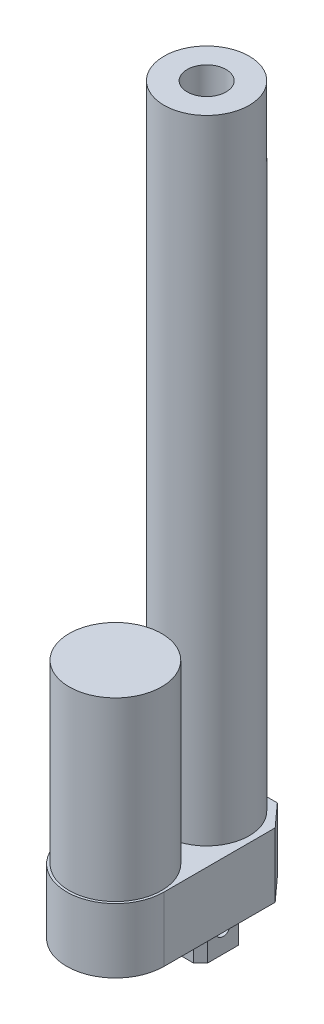
ISO-10303-21;
HEADER;
FILE_DESCRIPTION(('STEP AP214'),'2;1');
FILE_NAME('part.step','',(''),(''),'','','');
FILE_SCHEMA(('AUTOMOTIVE_DESIGN { 1 0 10303 214 1 1 1 1 }'));
ENDSEC;
DATA;
#1=APPLICATION_CONTEXT('core data for automotive mechanical design processes');
#2=APPLICATION_PROTOCOL_DEFINITION('international standard','automotive_design',2000,#1);
#3=PRODUCT_CONTEXT('',#1,'mechanical');
#4=PRODUCT('Part','Part','',(#3));
#5=PRODUCT_RELATED_PRODUCT_CATEGORY('part','',(#4));
#6=PRODUCT_DEFINITION_FORMATION('','',#4);
#7=PRODUCT_DEFINITION_CONTEXT('part definition',#1,'design');
#8=PRODUCT_DEFINITION('design','',#6,#7);
#9=PRODUCT_DEFINITION_SHAPE('','',#8);
#10=(LENGTH_UNIT() NAMED_UNIT(*) SI_UNIT(.MILLI.,.METRE.));
#11=(NAMED_UNIT(*) PLANE_ANGLE_UNIT() SI_UNIT($,.RADIAN.));
#12=(NAMED_UNIT(*) SI_UNIT($,.STERADIAN.) SOLID_ANGLE_UNIT());
#13=UNCERTAINTY_MEASURE_WITH_UNIT(LENGTH_MEASURE(1.E-05),#10,'distance_accuracy_value','');
#14=(GEOMETRIC_REPRESENTATION_CONTEXT(3) GLOBAL_UNCERTAINTY_ASSIGNED_CONTEXT((#13)) GLOBAL_UNIT_ASSIGNED_CONTEXT((#10,
#11,#12)) REPRESENTATION_CONTEXT('',''));
#15=CARTESIAN_POINT('',(0.,0.,0.));
#16=DIRECTION('',(0.,0.,1.));
#17=DIRECTION('',(1.,0.,0.));
#18=AXIS2_PLACEMENT_3D('',#15,#16,#17);
#19=CARTESIAN_POINT('',(0.,0.,17.5));
#20=DIRECTION('',(0.,1.,0.));
#21=DIRECTION('',(0.,0.,1.));
#22=AXIS2_PLACEMENT_3D('',#19,#20,#21);
#23=PLANE('',#22);
#24=DIRECTION('',(-0.671598777527421,0.,0.740915030231992));
#25=VECTOR('',#24,1.);
#26=CARTESIAN_POINT('',(-20.,0.,-28.1703672959389));
#27=LINE('',#26,#25);
#28=CARTESIAN_POINT('',(-11.5432004168341,0.,-37.5));
#29=VERTEX_POINT('',#28);
#30=CARTESIAN_POINT('',(-20.,0.,-28.1703672959389));
#31=VERTEX_POINT('',#30);
#32=EDGE_CURVE('E170',#29,#31,#27,.T.);
#33=ORIENTED_EDGE('',*,*,#32,.F.);
#34=DIRECTION('',(-1.,0.,0.));
#35=VECTOR('',#34,1.);
#36=CARTESIAN_POINT('',(11.5432004168341,0.,-37.5));
#37=LINE('',#36,#35);
#38=CARTESIAN_POINT('',(11.5432004168341,0.,-37.5));
#39=VERTEX_POINT('',#38);
#40=EDGE_CURVE('E176',#39,#29,#37,.T.);
#41=ORIENTED_EDGE('',*,*,#40,.F.);
#42=DIRECTION('',(-0.671598777527421,0.,-0.740915030231992));
#43=VECTOR('',#42,1.);
#44=CARTESIAN_POINT('',(20.,0.,-28.1703672959389));
#45=LINE('',#44,#43);
#46=CARTESIAN_POINT('',(20.,0.,-28.1703672959389));
#47=VERTEX_POINT('',#46);
#48=EDGE_CURVE('E197',#47,#39,#45,.T.);
#49=ORIENTED_EDGE('',*,*,#48,.F.);
#50=DIRECTION('',(0.,0.,-1.));
#51=VECTOR('',#50,1.);
#52=CARTESIAN_POINT('',(20.,0.,17.5));
#53=LINE('',#52,#51);
#54=CARTESIAN_POINT('',(20.,0.,17.5));
#55=VERTEX_POINT('',#54);
#56=EDGE_CURVE('E195',#55,#47,#53,.T.);
#57=ORIENTED_EDGE('',*,*,#56,.F.);
#58=CARTESIAN_POINT('',(0.,0.,17.5));
#59=DIRECTION('',(0.,1.,0.));
#60=DIRECTION('',(0.,0.,1.));
#61=AXIS2_PLACEMENT_3D('',#58,#59,#60);
#62=CIRCLE('',#61,20.);
#63=CARTESIAN_POINT('',(-20.,0.,17.5));
#64=VERTEX_POINT('',#63);
#65=EDGE_CURVE('E193',#64,#55,#62,.T.);
#66=ORIENTED_EDGE('',*,*,#65,.F.);
#67=DIRECTION('',(0.,0.,1.));
#68=VECTOR('',#67,1.);
#69=CARTESIAN_POINT('',(-20.,0.,17.5));
#70=LINE('',#69,#68);
#71=EDGE_CURVE('E191',#31,#64,#70,.T.);
#72=ORIENTED_EDGE('',*,*,#71,.F.);
#73=EDGE_LOOP('',(#33,#41,#49,#57,#66,#72));
#74=FACE_BOUND('',#73,.T.);
#75=DIRECTION('',(0.707106781186551,0.,-0.707106781186544));
#76=VECTOR('',#75,1.);
#77=CARTESIAN_POINT('',(-9.25,0.,-23.8703082855105));
#78=LINE('',#77,#76);
#79=CARTESIAN_POINT('',(-9.25,0.,-23.8703082855105));
#80=VERTEX_POINT('',#79);
#81=CARTESIAN_POINT('',(-6.37030828551044,0.,-26.75));
#82=VERTEX_POINT('',#81);
#83=EDGE_CURVE('E159',#80,#82,#78,.T.);
#84=ORIENTED_EDGE('',*,*,#83,.F.);
#85=DIRECTION('',(0.,0.,-1.));
#86=VECTOR('',#85,1.);
#87=CARTESIAN_POINT('',(-9.25,0.,-23.8703082855105));
#88=LINE('',#87,#86);
#89=CARTESIAN_POINT('',(-9.25,0.,-11.1296917144895));
#90=VERTEX_POINT('',#89);
#91=EDGE_CURVE('E156',#90,#80,#88,.T.);
#92=ORIENTED_EDGE('',*,*,#91,.F.);
#93=DIRECTION('',(-0.707106781186547,0.,-0.707106781186548));
#94=VECTOR('',#93,1.);
#95=CARTESIAN_POINT('',(-6.37030828551046,0.,-8.25));
#96=LINE('',#95,#94);
#97=CARTESIAN_POINT('',(-6.37030828551046,0.,-8.25));
#98=VERTEX_POINT('',#97);
#99=EDGE_CURVE('E283',#98,#90,#96,.T.);
#100=ORIENTED_EDGE('',*,*,#99,.F.);
#101=DIRECTION('',(-1.,0.,0.));
#102=VECTOR('',#101,1.);
#103=CARTESIAN_POINT('',(6.37030828551054,0.,-8.24999999999999));
#104=LINE('',#103,#102);
#105=CARTESIAN_POINT('',(6.37030828551054,0.,-8.24999999999999));
#106=VERTEX_POINT('',#105);
#107=EDGE_CURVE('E280',#106,#98,#104,.T.);
#108=ORIENTED_EDGE('',*,*,#107,.F.);
#109=DIRECTION('',(-0.707106781186551,0.,0.707106781186544));
#110=VECTOR('',#109,1.);
#111=CARTESIAN_POINT('',(9.25,0.,-11.1296917144894));
#112=LINE('',#111,#110);
#113=CARTESIAN_POINT('',(9.25,0.,-11.1296917144894));
#114=VERTEX_POINT('',#113);
#115=EDGE_CURVE('E277',#114,#106,#112,.T.);
#116=ORIENTED_EDGE('',*,*,#115,.F.);
#117=DIRECTION('',(0.,0.,1.));
#118=VECTOR('',#117,1.);
#119=CARTESIAN_POINT('',(9.25,0.,-23.8703082855104));
#120=LINE('',#119,#118);
#121=CARTESIAN_POINT('',(9.25,0.,-23.8703082855104));
#122=VERTEX_POINT('',#121);
#123=EDGE_CURVE('E274',#122,#114,#120,.T.);
#124=ORIENTED_EDGE('',*,*,#123,.F.);
#125=DIRECTION('',(0.707106781186541,0.,0.707106781186554));
#126=VECTOR('',#125,1.);
#127=CARTESIAN_POINT('',(6.37030828551048,0.,-26.75));
#128=LINE('',#127,#126);
#129=CARTESIAN_POINT('',(6.37030828551047,0.,-26.75));
#130=VERTEX_POINT('',#129);
#131=EDGE_CURVE('E271',#130,#122,#128,.T.);
#132=ORIENTED_EDGE('',*,*,#131,.F.);
#133=DIRECTION('',(1.,0.,0.));
#134=VECTOR('',#133,1.);
#135=CARTESIAN_POINT('',(6.37030828551048,0.,-26.75));
#136=LINE('',#135,#134);
#137=EDGE_CURVE('E54',#82,#130,#136,.T.);
#138=ORIENTED_EDGE('',*,*,#137,.F.);
#139=EDGE_LOOP('',(#84,#92,#100,#108,#116,#124,#132,#138));
#140=FACE_BOUND('',#139,.T.);
#141=ADVANCED_FACE('F34',(#74,#140),#23,.F.);
#142=CARTESIAN_POINT('',(-20.,26.5,-28.1703672959389));
#143=DIRECTION('',(0.740915030231992,0.,0.671598777527421));
#144=DIRECTION('',(0.671598777527421,0.,-0.740915030231992));
#145=AXIS2_PLACEMENT_3D('',#142,#143,#144);
#146=PLANE('',#145);
#147=ORIENTED_EDGE('',*,*,#32,.T.);
#148=DIRECTION('',(0.,-1.,0.));
#149=VECTOR('',#148,1.);
#150=CARTESIAN_POINT('',(-20.,26.5,-28.1703672959389));
#151=LINE('',#150,#149);
#152=CARTESIAN_POINT('',(-20.,26.5,-28.1703672959389));
#153=VERTEX_POINT('',#152);
#154=EDGE_CURVE('E11',#153,#31,#151,.T.);
#155=ORIENTED_EDGE('',*,*,#154,.F.);
#156=DIRECTION('',(-0.671598777527421,0.,0.740915030231992));
#157=VECTOR('',#156,1.);
#158=CARTESIAN_POINT('',(-20.,26.5,-28.1703672959389));
#159=LINE('',#158,#157);
#160=CARTESIAN_POINT('',(-11.5432004168341,26.5,-37.5));
#161=VERTEX_POINT('',#160);
#162=EDGE_CURVE('E172',#161,#153,#159,.T.);
#163=ORIENTED_EDGE('',*,*,#162,.F.);
#164=DIRECTION('',(0.,-1.,0.));
#165=VECTOR('',#164,1.);
#166=CARTESIAN_POINT('',(-11.5432004168341,26.5,-37.5));
#167=LINE('',#166,#165);
#168=EDGE_CURVE('E188',#161,#29,#167,.T.);
#169=ORIENTED_EDGE('',*,*,#168,.T.);
#170=EDGE_LOOP('',(#147,#155,#163,#169));
#171=FACE_BOUND('',#170,.T.);
#172=ADVANCED_FACE('F36',(#171),#146,.F.);
#173=CARTESIAN_POINT('',(-20.,26.5,17.5));
#174=DIRECTION('',(1.,0.,0.));
#175=DIRECTION('',(0.,0.,-1.));
#176=AXIS2_PLACEMENT_3D('',#173,#174,#175);
#177=PLANE('',#176);
#178=ORIENTED_EDGE('',*,*,#71,.T.);
#179=DIRECTION('',(0.,-1.,0.));
#180=VECTOR('',#179,1.);
#181=CARTESIAN_POINT('',(-20.,26.5,17.5));
#182=LINE('',#181,#180);
#183=CARTESIAN_POINT('',(-20.,26.5,17.5));
#184=VERTEX_POINT('',#183);
#185=EDGE_CURVE('E42',#184,#64,#182,.T.);
#186=ORIENTED_EDGE('',*,*,#185,.F.);
#187=DIRECTION('',(0.,0.,1.));
#188=VECTOR('',#187,1.);
#189=CARTESIAN_POINT('',(-20.,26.5,17.5));
#190=LINE('',#189,#188);
#191=EDGE_CURVE('E175',#153,#184,#190,.T.);
#192=ORIENTED_EDGE('',*,*,#191,.F.);
#193=ORIENTED_EDGE('',*,*,#154,.T.);
#194=EDGE_LOOP('',(#178,#186,#192,#193));
#195=FACE_BOUND('',#194,.T.);
#196=ADVANCED_FACE('F236',(#195),#177,.F.);
#197=CARTESIAN_POINT('',(0.,26.5,17.5));
#198=DIRECTION('',(0.,-1.,0.));
#199=DIRECTION('',(0.,0.,-1.));
#200=AXIS2_PLACEMENT_3D('',#197,#198,#199);
#201=CYLINDRICAL_SURFACE('',#200,20.);
#202=ORIENTED_EDGE('',*,*,#65,.T.);
#203=DIRECTION('',(0.,-1.,0.));
#204=VECTOR('',#203,1.);
#205=CARTESIAN_POINT('',(20.,26.5,17.5));
#206=LINE('',#205,#204);
#207=CARTESIAN_POINT('',(20.,26.5,17.5));
#208=VERTEX_POINT('',#207);
#209=EDGE_CURVE('E208',#208,#55,#206,.T.);
#210=ORIENTED_EDGE('',*,*,#209,.F.);
#211=CARTESIAN_POINT('',(0.,26.5,17.5));
#212=DIRECTION('',(0.,1.,0.));
#213=DIRECTION('',(0.,0.,1.));
#214=AXIS2_PLACEMENT_3D('',#211,#212,#213);
#215=CIRCLE('',#214,20.);
#216=EDGE_CURVE('E178',#184,#208,#215,.T.);
#217=ORIENTED_EDGE('',*,*,#216,.F.);
#218=ORIENTED_EDGE('',*,*,#185,.T.);
#219=EDGE_LOOP('',(#202,#210,#217,#218));
#220=FACE_BOUND('',#219,.T.);
#221=ADVANCED_FACE('F215',(#220),#201,.T.);
#222=CARTESIAN_POINT('',(20.,26.5,17.5));
#223=DIRECTION('',(-1.,0.,0.));
#224=DIRECTION('',(0.,0.,1.));
#225=AXIS2_PLACEMENT_3D('',#222,#223,#224);
#226=PLANE('',#225);
#227=ORIENTED_EDGE('',*,*,#56,.T.);
#228=DIRECTION('',(0.,-1.,0.));
#229=VECTOR('',#228,1.);
#230=CARTESIAN_POINT('',(20.,26.5,-28.1703672959389));
#231=LINE('',#230,#229);
#232=CARTESIAN_POINT('',(20.,26.5,-28.1703672959389));
#233=VERTEX_POINT('',#232);
#234=EDGE_CURVE('E205',#233,#47,#231,.T.);
#235=ORIENTED_EDGE('',*,*,#234,.F.);
#236=DIRECTION('',(0.,0.,-1.));
#237=VECTOR('',#236,1.);
#238=CARTESIAN_POINT('',(20.,26.5,17.5));
#239=LINE('',#238,#237);
#240=EDGE_CURVE('E180',#208,#233,#239,.T.);
#241=ORIENTED_EDGE('',*,*,#240,.F.);
#242=ORIENTED_EDGE('',*,*,#209,.T.);
#243=EDGE_LOOP('',(#227,#235,#241,#242));
#244=FACE_BOUND('',#243,.T.);
#245=ADVANCED_FACE('F225',(#244),#226,.F.);
#246=CARTESIAN_POINT('',(20.,26.5,-28.1703672959389));
#247=DIRECTION('',(-0.740915030231992,0.,0.671598777527421));
#248=DIRECTION('',(0.671598777527421,0.,0.740915030231992));
#249=AXIS2_PLACEMENT_3D('',#246,#247,#248);
#250=PLANE('',#249);
#251=ORIENTED_EDGE('',*,*,#48,.T.);
#252=DIRECTION('',(0.,-1.,0.));
#253=VECTOR('',#252,1.);
#254=CARTESIAN_POINT('',(11.5432004168341,26.5,-37.5));
#255=LINE('',#254,#253);
#256=CARTESIAN_POINT('',(11.5432004168341,26.5,-37.5));
#257=VERTEX_POINT('',#256);
#258=EDGE_CURVE('E202',#257,#39,#255,.T.);
#259=ORIENTED_EDGE('',*,*,#258,.F.);
#260=DIRECTION('',(-0.671598777527421,0.,-0.740915030231992));
#261=VECTOR('',#260,1.);
#262=CARTESIAN_POINT('',(20.,26.5,-28.1703672959389));
#263=LINE('',#262,#261);
#264=EDGE_CURVE('E182',#233,#257,#263,.T.);
#265=ORIENTED_EDGE('',*,*,#264,.F.);
#266=ORIENTED_EDGE('',*,*,#234,.T.);
#267=EDGE_LOOP('',(#251,#259,#265,#266));
#268=FACE_BOUND('',#267,.T.);
#269=ADVANCED_FACE('F229',(#268),#250,.F.);
#270=CARTESIAN_POINT('',(11.5432004168341,26.5,-37.5));
#271=DIRECTION('',(0.,0.,1.));
#272=DIRECTION('',(1.,0.,0.));
#273=AXIS2_PLACEMENT_3D('',#270,#271,#272);
#274=PLANE('',#273);
#275=ORIENTED_EDGE('',*,*,#40,.T.);
#276=ORIENTED_EDGE('',*,*,#168,.F.);
#277=DIRECTION('',(-1.,0.,0.));
#278=VECTOR('',#277,1.);
#279=CARTESIAN_POINT('',(11.5432004168341,26.5,-37.5));
#280=LINE('',#279,#278);
#281=CARTESIAN_POINT('',(0.,26.5,-37.5));
#282=VERTEX_POINT('',#281);
#283=EDGE_CURVE('E184',#282,#161,#280,.T.);
#284=ORIENTED_EDGE('',*,*,#283,.F.);
#285=EDGE_CURVE('E185',#257,#282,#280,.T.);
#286=ORIENTED_EDGE('',*,*,#285,.F.);
#287=ORIENTED_EDGE('',*,*,#258,.T.);
#288=EDGE_LOOP('',(#275,#276,#284,#286,#287));
#289=FACE_BOUND('',#288,.T.);
#290=ADVANCED_FACE('F240',(#289),#274,.F.);
#291=CARTESIAN_POINT('',(0.,26.5,17.5));
#292=DIRECTION('',(0.,1.,0.));
#293=DIRECTION('',(0.,0.,1.));
#294=AXIS2_PLACEMENT_3D('',#291,#292,#293);
#295=PLANE('',#294);
#296=CARTESIAN_POINT('',(0.,26.5,17.5));
#297=DIRECTION('',(0.,1.,0.));
#298=DIRECTION('',(0.,0.,1.));
#299=AXIS2_PLACEMENT_3D('',#296,#297,#298);
#300=CIRCLE('',#299,19.);
#301=CARTESIAN_POINT('',(0.,26.5,36.5));
#302=VERTEX_POINT('',#301);
#303=EDGE_CURVE('E160',#302,#302,#300,.T.);
#304=ORIENTED_EDGE('',*,*,#303,.F.);
#305=EDGE_LOOP('',(#304));
#306=FACE_BOUND('',#305,.T.);
#307=ORIENTED_EDGE('',*,*,#285,.T.);
#308=CARTESIAN_POINT('',(0.,26.5,-20.));
#309=DIRECTION('',(0.,1.,0.));
#310=DIRECTION('',(0.,0.,1.));
#311=AXIS2_PLACEMENT_3D('',#308,#309,#310);
#312=CIRCLE('',#311,17.5);
#313=EDGE_CURVE('E47',#282,#282,#312,.T.);
#314=ORIENTED_EDGE('',*,*,#313,.F.);
#315=ORIENTED_EDGE('',*,*,#283,.T.);
#316=ORIENTED_EDGE('',*,*,#162,.T.);
#317=ORIENTED_EDGE('',*,*,#191,.T.);
#318=ORIENTED_EDGE('',*,*,#216,.T.);
#319=ORIENTED_EDGE('',*,*,#240,.T.);
#320=ORIENTED_EDGE('',*,*,#264,.T.);
#321=EDGE_LOOP('',(#307,#314,#315,#316,#317,#318,#319,#320));
#322=FACE_BOUND('',#321,.T.);
#323=ADVANCED_FACE('F233',(#306,#322),#295,.T.);
#324=CARTESIAN_POINT('',(0.,99.,17.5));
#325=DIRECTION('',(0.,-1.,0.));
#326=DIRECTION('',(0.,0.,-1.));
#327=AXIS2_PLACEMENT_3D('',#324,#325,#326);
#328=CYLINDRICAL_SURFACE('',#327,19.);
#329=CARTESIAN_POINT('',(0.,99.,17.5));
#330=DIRECTION('',(0.,1.,0.));
#331=DIRECTION('',(0.,0.,1.));
#332=AXIS2_PLACEMENT_3D('',#329,#330,#331);
#333=CIRCLE('',#332,19.);
#334=CARTESIAN_POINT('',(0.,99.,36.5));
#335=VERTEX_POINT('',#334);
#336=EDGE_CURVE('E163',#335,#335,#333,.T.);
#337=ORIENTED_EDGE('',*,*,#336,.F.);
#338=EDGE_LOOP('',(#337));
#339=FACE_BOUND('',#338,.T.);
#340=ORIENTED_EDGE('',*,*,#303,.T.);
#341=EDGE_LOOP('',(#340));
#342=FACE_BOUND('',#341,.T.);
#343=ADVANCED_FACE('F376',(#339,#342),#328,.T.);
#344=CARTESIAN_POINT('',(0.,99.,17.5));
#345=DIRECTION('',(0.,1.,0.));
#346=DIRECTION('',(0.,0.,1.));
#347=AXIS2_PLACEMENT_3D('',#344,#345,#346);
#348=PLANE('',#347);
#349=ORIENTED_EDGE('',*,*,#336,.T.);
#350=EDGE_LOOP('',(#349));
#351=FACE_BOUND('',#350,.T.);
#352=ADVANCED_FACE('F383',(#351),#348,.T.);
#353=CARTESIAN_POINT('',(-9.25,-18.5,-23.8703082855105));
#354=DIRECTION('',(0.707106781186544,0.,0.707106781186551));
#355=DIRECTION('',(0.707106781186551,0.,-0.707106781186544));
#356=AXIS2_PLACEMENT_3D('',#353,#354,#355);
#357=PLANE('',#356);
#358=ORIENTED_EDGE('',*,*,#83,.T.);
#359=DIRECTION('',(0.,1.,0.));
#360=VECTOR('',#359,1.);
#361=CARTESIAN_POINT('',(-6.37030828551044,-18.5,-26.75));
#362=LINE('',#361,#360);
#363=CARTESIAN_POINT('',(-6.37030828551044,-18.5,-26.75));
#364=VERTEX_POINT('',#363);
#365=EDGE_CURVE('E140',#364,#82,#362,.T.);
#366=ORIENTED_EDGE('',*,*,#365,.F.);
#367=DIRECTION('',(0.707106781186551,0.,-0.707106781186544));
#368=VECTOR('',#367,1.);
#369=CARTESIAN_POINT('',(-9.25,-18.5,-23.8703082855105));
#370=LINE('',#369,#368);
#371=CARTESIAN_POINT('',(-9.25,-18.5,-23.8703082855105));
#372=VERTEX_POINT('',#371);
#373=EDGE_CURVE('E147',#372,#364,#370,.T.);
#374=ORIENTED_EDGE('',*,*,#373,.F.);
#375=DIRECTION('',(0.,1.,0.));
#376=VECTOR('',#375,1.);
#377=CARTESIAN_POINT('',(-9.25,-18.5,-23.8703082855105));
#378=LINE('',#377,#376);
#379=EDGE_CURVE('E268',#372,#80,#378,.T.);
#380=ORIENTED_EDGE('',*,*,#379,.T.);
#381=EDGE_LOOP('',(#358,#366,#374,#380));
#382=FACE_BOUND('',#381,.T.);
#383=ADVANCED_FACE('F158',(#382),#357,.F.);
#384=CARTESIAN_POINT('',(6.37030828551048,-18.5,-26.75));
#385=DIRECTION('',(0.,0.,1.));
#386=DIRECTION('',(1.,0.,0.));
#387=AXIS2_PLACEMENT_3D('',#384,#385,#386);
#388=PLANE('',#387);
#389=ORIENTED_EDGE('',*,*,#137,.T.);
#390=DIRECTION('',(0.,1.,0.));
#391=VECTOR('',#390,1.);
#392=CARTESIAN_POINT('',(6.37030828551048,-18.5,-26.75));
#393=LINE('',#392,#391);
#394=CARTESIAN_POINT('',(6.37030828551048,-18.5,-26.75));
#395=VERTEX_POINT('',#394);
#396=EDGE_CURVE('E143',#395,#130,#393,.T.);
#397=ORIENTED_EDGE('',*,*,#396,.F.);
#398=DIRECTION('',(1.,0.,0.));
#399=VECTOR('',#398,1.);
#400=CARTESIAN_POINT('',(6.37030828551048,-18.5,-26.75));
#401=LINE('',#400,#399);
#402=EDGE_CURVE('E136',#364,#395,#401,.T.);
#403=ORIENTED_EDGE('',*,*,#402,.F.);
#404=ORIENTED_EDGE('',*,*,#365,.T.);
#405=EDGE_LOOP('',(#389,#397,#403,#404));
#406=FACE_BOUND('',#405,.T.);
#407=ADVANCED_FACE('F138',(#406),#388,.F.);
#408=CARTESIAN_POINT('',(6.37030828551048,-18.5,-26.75));
#409=DIRECTION('',(-0.707106781186554,0.,0.707106781186541));
#410=DIRECTION('',(0.707106781186541,0.,0.707106781186554));
#411=AXIS2_PLACEMENT_3D('',#408,#409,#410);
#412=PLANE('',#411);
#413=ORIENTED_EDGE('',*,*,#131,.T.);
#414=DIRECTION('',(0.,1.,0.));
#415=VECTOR('',#414,1.);
#416=CARTESIAN_POINT('',(9.25,-18.5,-23.8703082855104));
#417=LINE('',#416,#415);
#418=CARTESIAN_POINT('',(9.25,-18.5,-23.8703082855104));
#419=VERTEX_POINT('',#418);
#420=EDGE_CURVE('E165',#419,#122,#417,.T.);
#421=ORIENTED_EDGE('',*,*,#420,.F.);
#422=DIRECTION('',(0.707106781186541,0.,0.707106781186554));
#423=VECTOR('',#422,1.);
#424=CARTESIAN_POINT('',(6.37030828551048,-18.5,-26.75));
#425=LINE('',#424,#423);
#426=EDGE_CURVE('E146',#395,#419,#425,.T.);
#427=ORIENTED_EDGE('',*,*,#426,.F.);
#428=ORIENTED_EDGE('',*,*,#396,.T.);
#429=EDGE_LOOP('',(#413,#421,#427,#428));
#430=FACE_BOUND('',#429,.T.);
#431=ADVANCED_FACE('F307',(#430),#412,.F.);
#432=CARTESIAN_POINT('',(9.25,-18.5,-23.8703082855104));
#433=DIRECTION('',(-1.,0.,0.));
#434=DIRECTION('',(0.,0.,1.));
#435=AXIS2_PLACEMENT_3D('',#432,#433,#434);
#436=PLANE('',#435);
#437=CARTESIAN_POINT('',(9.25,-9.25,-17.4999999999999));
#438=DIRECTION('',(1.,0.,0.));
#439=DIRECTION('',(0.,0.,-1.));
#440=AXIS2_PLACEMENT_3D('',#437,#438,#439);
#441=CIRCLE('',#440,3.);
#442=CARTESIAN_POINT('',(9.25,-9.25,-20.4999999999999));
#443=VERTEX_POINT('',#442);
#444=EDGE_CURVE('E246',#443,#443,#441,.T.);
#445=ORIENTED_EDGE('',*,*,#444,.F.);
#446=EDGE_LOOP('',(#445));
#447=FACE_BOUND('',#446,.T.);
#448=ORIENTED_EDGE('',*,*,#123,.T.);
#449=DIRECTION('',(0.,1.,0.));
#450=VECTOR('',#449,1.);
#451=CARTESIAN_POINT('',(9.25,-18.5,-11.1296917144894));
#452=LINE('',#451,#450);
#453=CARTESIAN_POINT('',(9.25,-18.5,-11.1296917144894));
#454=VERTEX_POINT('',#453);
#455=EDGE_CURVE('E298',#454,#114,#452,.T.);
#456=ORIENTED_EDGE('',*,*,#455,.F.);
#457=DIRECTION('',(0.,0.,1.));
#458=VECTOR('',#457,1.);
#459=CARTESIAN_POINT('',(9.25,-18.5,-23.8703082855104));
#460=LINE('',#459,#458);
#461=EDGE_CURVE('E259',#419,#454,#460,.T.);
#462=ORIENTED_EDGE('',*,*,#461,.F.);
#463=ORIENTED_EDGE('',*,*,#420,.T.);
#464=EDGE_LOOP('',(#448,#456,#462,#463));
#465=FACE_BOUND('',#464,.T.);
#466=ADVANCED_FACE('F304',(#447,#465),#436,.F.);
#467=CARTESIAN_POINT('',(9.25,-18.5,-11.1296917144894));
#468=DIRECTION('',(-0.707106781186544,0.,-0.707106781186552));
#469=DIRECTION('',(-0.707106781186551,0.,0.707106781186544));
#470=AXIS2_PLACEMENT_3D('',#467,#468,#469);
#471=PLANE('',#470);
#472=ORIENTED_EDGE('',*,*,#115,.T.);
#473=DIRECTION('',(0.,1.,0.));
#474=VECTOR('',#473,1.);
#475=CARTESIAN_POINT('',(6.37030828551054,-18.5,-8.24999999999999));
#476=LINE('',#475,#474);
#477=CARTESIAN_POINT('',(6.37030828551054,-18.5,-8.24999999999999));
#478=VERTEX_POINT('',#477);
#479=EDGE_CURVE('E295',#478,#106,#476,.T.);
#480=ORIENTED_EDGE('',*,*,#479,.F.);
#481=DIRECTION('',(-0.707106781186551,0.,0.707106781186544));
#482=VECTOR('',#481,1.);
#483=CARTESIAN_POINT('',(9.25,-18.5,-11.1296917144894));
#484=LINE('',#483,#482);
#485=EDGE_CURVE('E261',#454,#478,#484,.T.);
#486=ORIENTED_EDGE('',*,*,#485,.F.);
#487=ORIENTED_EDGE('',*,*,#455,.T.);
#488=EDGE_LOOP('',(#472,#480,#486,#487));
#489=FACE_BOUND('',#488,.T.);
#490=ADVANCED_FACE('F310',(#489),#471,.F.);
#491=CARTESIAN_POINT('',(6.37030828551054,-18.5,-8.24999999999999));
#492=DIRECTION('',(0.,0.,-1.));
#493=DIRECTION('',(-1.,0.,0.));
#494=AXIS2_PLACEMENT_3D('',#491,#492,#493);
#495=PLANE('',#494);
#496=ORIENTED_EDGE('',*,*,#107,.T.);
#497=DIRECTION('',(0.,1.,0.));
#498=VECTOR('',#497,1.);
#499=CARTESIAN_POINT('',(-6.37030828551046,-18.5,-8.25));
#500=LINE('',#499,#498);
#501=CARTESIAN_POINT('',(-6.37030828551046,-18.5,-8.25));
#502=VERTEX_POINT('',#501);
#503=EDGE_CURVE('E292',#502,#98,#500,.T.);
#504=ORIENTED_EDGE('',*,*,#503,.F.);
#505=DIRECTION('',(-1.,0.,0.));
#506=VECTOR('',#505,1.);
#507=CARTESIAN_POINT('',(6.37030828551054,-18.5,-8.24999999999999));
#508=LINE('',#507,#506);
#509=EDGE_CURVE('E263',#478,#502,#508,.T.);
#510=ORIENTED_EDGE('',*,*,#509,.F.);
#511=ORIENTED_EDGE('',*,*,#479,.T.);
#512=EDGE_LOOP('',(#496,#504,#510,#511));
#513=FACE_BOUND('',#512,.T.);
#514=ADVANCED_FACE('F314',(#513),#495,.F.);
#515=CARTESIAN_POINT('',(-6.37030828551046,-18.5,-8.25));
#516=DIRECTION('',(0.707106781186548,0.,-0.707106781186547));
#517=DIRECTION('',(-0.707106781186547,0.,-0.707106781186548));
#518=AXIS2_PLACEMENT_3D('',#515,#516,#517);
#519=PLANE('',#518);
#520=ORIENTED_EDGE('',*,*,#99,.T.);
#521=DIRECTION('',(0.,1.,0.));
#522=VECTOR('',#521,1.);
#523=CARTESIAN_POINT('',(-9.25,-18.5,-11.1296917144895));
#524=LINE('',#523,#522);
#525=CARTESIAN_POINT('',(-9.25,-18.5,-11.1296917144895));
#526=VERTEX_POINT('',#525);
#527=EDGE_CURVE('E289',#526,#90,#524,.T.);
#528=ORIENTED_EDGE('',*,*,#527,.F.);
#529=DIRECTION('',(-0.707106781186547,0.,-0.707106781186548));
#530=VECTOR('',#529,1.);
#531=CARTESIAN_POINT('',(-6.37030828551046,-18.5,-8.25));
#532=LINE('',#531,#530);
#533=EDGE_CURVE('E265',#502,#526,#532,.T.);
#534=ORIENTED_EDGE('',*,*,#533,.F.);
#535=ORIENTED_EDGE('',*,*,#503,.T.);
#536=EDGE_LOOP('',(#520,#528,#534,#535));
#537=FACE_BOUND('',#536,.T.);
#538=ADVANCED_FACE('F319',(#537),#519,.F.);
#539=CARTESIAN_POINT('',(-9.25,-18.5,-23.8703082855105));
#540=DIRECTION('',(1.,0.,0.));
#541=DIRECTION('',(0.,0.,-1.));
#542=AXIS2_PLACEMENT_3D('',#539,#540,#541);
#543=PLANE('',#542);
#544=CARTESIAN_POINT('',(-9.25,-9.25,-17.4999999999999));
#545=DIRECTION('',(1.,0.,0.));
#546=DIRECTION('',(0.,0.,-1.));
#547=AXIS2_PLACEMENT_3D('',#544,#545,#546);
#548=CIRCLE('',#547,3.);
#549=CARTESIAN_POINT('',(-9.25,-9.25,-20.4999999999999));
#550=VERTEX_POINT('',#549);
#551=EDGE_CURVE('E253',#550,#550,#548,.T.);
#552=ORIENTED_EDGE('',*,*,#551,.T.);
#553=EDGE_LOOP('',(#552));
#554=FACE_BOUND('',#553,.T.);
#555=ORIENTED_EDGE('',*,*,#91,.T.);
#556=ORIENTED_EDGE('',*,*,#379,.F.);
#557=DIRECTION('',(0.,0.,-1.));
#558=VECTOR('',#557,1.);
#559=CARTESIAN_POINT('',(-9.25,-18.5,-23.8703082855105));
#560=LINE('',#559,#558);
#561=EDGE_CURVE('E152',#526,#372,#560,.T.);
#562=ORIENTED_EDGE('',*,*,#561,.F.);
#563=ORIENTED_EDGE('',*,*,#527,.T.);
#564=EDGE_LOOP('',(#555,#556,#562,#563));
#565=FACE_BOUND('',#564,.T.);
#566=ADVANCED_FACE('F321',(#554,#565),#543,.F.);
#567=CARTESIAN_POINT('',(0.,-18.5,0.));
#568=DIRECTION('',(0.,-1.,0.));
#569=DIRECTION('',(0.,0.,-1.));
#570=AXIS2_PLACEMENT_3D('',#567,#568,#569);
#571=PLANE('',#570);
#572=ORIENTED_EDGE('',*,*,#373,.T.);
#573=ORIENTED_EDGE('',*,*,#402,.T.);
#574=ORIENTED_EDGE('',*,*,#426,.T.);
#575=ORIENTED_EDGE('',*,*,#461,.T.);
#576=ORIENTED_EDGE('',*,*,#485,.T.);
#577=ORIENTED_EDGE('',*,*,#509,.T.);
#578=ORIENTED_EDGE('',*,*,#533,.T.);
#579=ORIENTED_EDGE('',*,*,#561,.T.);
#580=EDGE_LOOP('',(#572,#573,#574,#575,#576,#577,#578,#579));
#581=FACE_BOUND('',#580,.T.);
#582=ADVANCED_FACE('F150',(#581),#571,.T.);
#583=CARTESIAN_POINT('',(-9.25,-9.25,-17.4999999999999));
#584=DIRECTION('',(1.,0.,0.));
#585=DIRECTION('',(0.,0.,-1.));
#586=AXIS2_PLACEMENT_3D('',#583,#584,#585);
#587=CYLINDRICAL_SURFACE('',#586,3.);
#588=ORIENTED_EDGE('',*,*,#551,.F.);
#589=EDGE_LOOP('',(#588));
#590=FACE_BOUND('',#589,.T.);
#591=ORIENTED_EDGE('',*,*,#444,.T.);
#592=EDGE_LOOP('',(#591));
#593=FACE_BOUND('',#592,.T.);
#594=ADVANCED_FACE('F329',(#590,#593),#587,.F.);
#595=CARTESIAN_POINT('',(0.,286.5,-20.));
#596=DIRECTION('',(0.,-1.,0.));
#597=DIRECTION('',(0.,0.,-1.));
#598=AXIS2_PLACEMENT_3D('',#595,#596,#597);
#599=CYLINDRICAL_SURFACE('',#598,17.5);
#600=CARTESIAN_POINT('',(0.,286.5,-20.));
#601=DIRECTION('',(0.,1.,0.));
#602=DIRECTION('',(0.,0.,1.));
#603=AXIS2_PLACEMENT_3D('',#600,#601,#602);
#604=CIRCLE('',#603,17.5);
#605=CARTESIAN_POINT('',(0.,286.5,-2.5));
#606=VERTEX_POINT('',#605);
#607=EDGE_CURVE('E242',#606,#606,#604,.T.);
#608=ORIENTED_EDGE('',*,*,#607,.F.);
#609=EDGE_LOOP('',(#608));
#610=FACE_BOUND('',#609,.T.);
#611=ORIENTED_EDGE('',*,*,#313,.T.);
#612=EDGE_LOOP('',(#611));
#613=FACE_BOUND('',#612,.T.);
#614=ADVANCED_FACE('F447',(#610,#613),#599,.T.);
#615=CARTESIAN_POINT('',(0.,286.5,-20.));
#616=DIRECTION('',(0.,1.,0.));
#617=DIRECTION('',(0.,0.,1.));
#618=AXIS2_PLACEMENT_3D('',#615,#616,#617);
#619=PLANE('',#618);
#620=CARTESIAN_POINT('',(0.,286.5,-20.));
#621=DIRECTION('',(0.,1.,0.));
#622=DIRECTION('',(0.,0.,1.));
#623=AXIS2_PLACEMENT_3D('',#620,#621,#622);
#624=CIRCLE('',#623,8.);
#625=CARTESIAN_POINT('',(0.,286.5,-12.));
#626=VERTEX_POINT('',#625);
#627=EDGE_CURVE('E249',#626,#626,#624,.T.);
#628=ORIENTED_EDGE('',*,*,#627,.F.);
#629=EDGE_LOOP('',(#628));
#630=FACE_BOUND('',#629,.T.);
#631=ORIENTED_EDGE('',*,*,#607,.T.);
#632=EDGE_LOOP('',(#631));
#633=FACE_BOUND('',#632,.T.);
#634=ADVANCED_FACE('F454',(#630,#633),#619,.T.);
#635=CARTESIAN_POINT('',(0.,86.5,-20.));
#636=DIRECTION('',(0.,1.,0.));
#637=DIRECTION('',(0.,0.,1.));
#638=AXIS2_PLACEMENT_3D('',#635,#636,#637);
#639=CYLINDRICAL_SURFACE('',#638,8.);
#640=CARTESIAN_POINT('',(0.,86.5,-20.));
#641=DIRECTION('',(0.,1.,0.));
#642=DIRECTION('',(0.,0.,1.));
#643=AXIS2_PLACEMENT_3D('',#640,#641,#642);
#644=CIRCLE('',#643,8.);
#645=CARTESIAN_POINT('',(0.,86.5,-12.));
#646=VERTEX_POINT('',#645);
#647=EDGE_CURVE('E243',#646,#646,#644,.T.);
#648=ORIENTED_EDGE('',*,*,#647,.F.);
#649=EDGE_LOOP('',(#648));
#650=FACE_BOUND('',#649,.T.);
#651=ORIENTED_EDGE('',*,*,#627,.T.);
#652=EDGE_LOOP('',(#651));
#653=FACE_BOUND('',#652,.T.);
#654=ADVANCED_FACE('F461',(#650,#653),#639,.F.);
#655=CARTESIAN_POINT('',(0.,86.5,-20.));
#656=DIRECTION('',(0.,1.,0.));
#657=DIRECTION('',(0.,0.,1.));
#658=AXIS2_PLACEMENT_3D('',#655,#656,#657);
#659=PLANE('',#658);
#660=ORIENTED_EDGE('',*,*,#647,.T.);
#661=EDGE_LOOP('',(#660));
#662=FACE_BOUND('',#661,.T.);
#663=ADVANCED_FACE('F469',(#662),#659,.T.);
#664=CLOSED_SHELL('',(#141,#172,#196,#221,#245,#269,#290,#323,#343,#352,#383,#407,#431,#466,
#490,#514,#538,#566,#582,#594,#614,#634,#654,#663));
#665=MANIFOLD_SOLID_BREP('B2',#664);
#666=ADVANCED_BREP_SHAPE_REPRESENTATION('',(#18,#665),#14);
#667=SHAPE_DEFINITION_REPRESENTATION(#9,#666);
ENDSEC;
END-ISO-10303-21;
